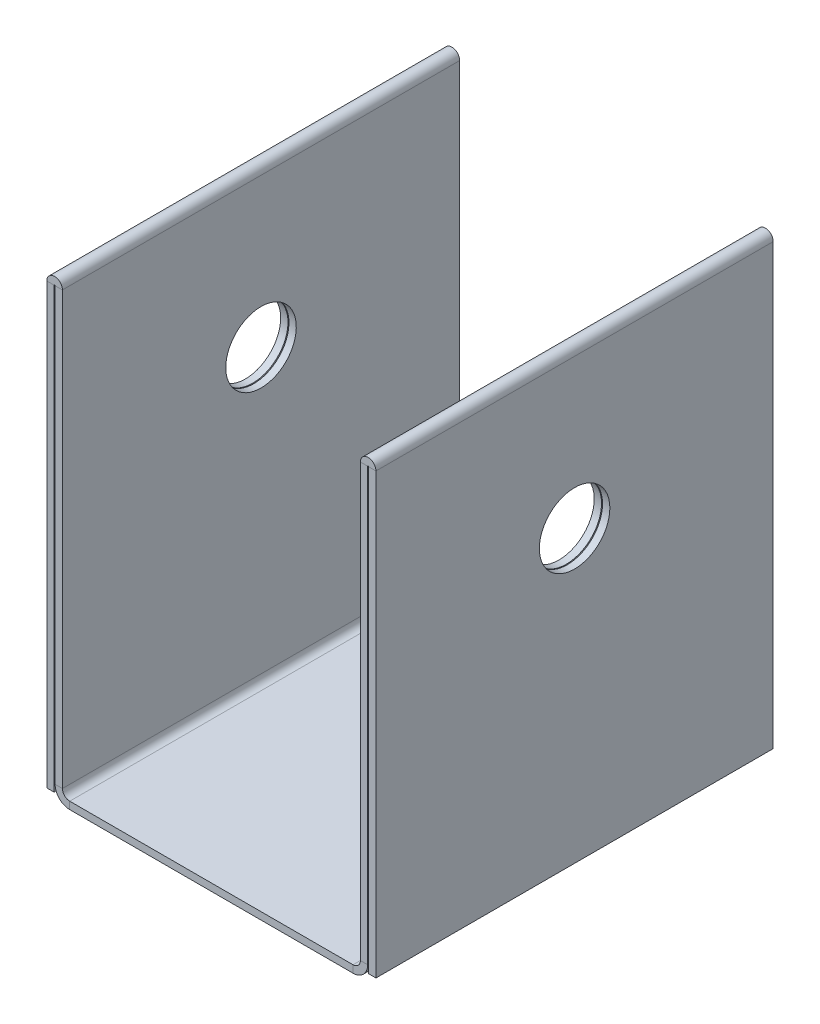
ISO-10303-21;
HEADER;
FILE_DESCRIPTION(('STEP AP214'),'2;1');
FILE_NAME('part.step','',(''),(''),'','','');
FILE_SCHEMA(('AUTOMOTIVE_DESIGN { 1 0 10303 214 1 1 1 1 }'));
ENDSEC;
DATA;
#1=APPLICATION_CONTEXT('core data for automotive mechanical design processes');
#2=APPLICATION_PROTOCOL_DEFINITION('international standard','automotive_design',2000,#1);
#3=PRODUCT_CONTEXT('',#1,'mechanical');
#4=PRODUCT('Part','Part','',(#3));
#5=PRODUCT_RELATED_PRODUCT_CATEGORY('part','',(#4));
#6=PRODUCT_DEFINITION_FORMATION('','',#4);
#7=PRODUCT_DEFINITION_CONTEXT('part definition',#1,'design');
#8=PRODUCT_DEFINITION('design','',#6,#7);
#9=PRODUCT_DEFINITION_SHAPE('','',#8);
#10=(LENGTH_UNIT() NAMED_UNIT(*) SI_UNIT(.MILLI.,.METRE.));
#11=(NAMED_UNIT(*) PLANE_ANGLE_UNIT() SI_UNIT($,.RADIAN.));
#12=(NAMED_UNIT(*) SI_UNIT($,.STERADIAN.) SOLID_ANGLE_UNIT());
#13=UNCERTAINTY_MEASURE_WITH_UNIT(LENGTH_MEASURE(1.E-05),#10,'distance_accuracy_value','');
#14=(GEOMETRIC_REPRESENTATION_CONTEXT(3) GLOBAL_UNCERTAINTY_ASSIGNED_CONTEXT((#13)) GLOBAL_UNIT_ASSIGNED_CONTEXT((#10,
#11,#12)) REPRESENTATION_CONTEXT('',''));
#15=CARTESIAN_POINT('',(0.,0.,0.));
#16=DIRECTION('',(0.,0.,1.));
#17=DIRECTION('',(1.,0.,0.));
#18=AXIS2_PLACEMENT_3D('',#15,#16,#17);
#19=CARTESIAN_POINT('',(0.,-0.7366,0.));
#20=DIRECTION('',(0.,1.,0.));
#21=DIRECTION('',(0.,0.,1.));
#22=AXIS2_PLACEMENT_3D('',#19,#20,#21);
#23=PLANE('',#22);
#24=DIRECTION('',(0.,0.,1.));
#25=VECTOR('',#24,1.);
#26=CARTESIAN_POINT('',(-14.2634,-0.736600000000002,20.));
#27=LINE('',#26,#25);
#28=CARTESIAN_POINT('',(-14.2634,-0.736600000000002,20.));
#29=VERTEX_POINT('',#28);
#30=CARTESIAN_POINT('',(-14.2634,-0.7366,-20.));
#31=VERTEX_POINT('',#30);
#32=EDGE_CURVE('E221',#29,#31,#27,.F.);
#33=ORIENTED_EDGE('',*,*,#32,.T.);
#34=DIRECTION('',(-1.,0.,0.));
#35=VECTOR('',#34,1.);
#36=CARTESIAN_POINT('',(-15.,-0.7366,-20.));
#37=LINE('',#36,#35);
#38=CARTESIAN_POINT('',(14.2634,-0.736599999999999,-20.));
#39=VERTEX_POINT('',#38);
#40=EDGE_CURVE('E44',#39,#31,#37,.T.);
#41=ORIENTED_EDGE('',*,*,#40,.F.);
#42=DIRECTION('',(0.,0.,-1.));
#43=VECTOR('',#42,1.);
#44=CARTESIAN_POINT('',(14.2634,-0.736599999999999,-20.));
#45=LINE('',#44,#43);
#46=CARTESIAN_POINT('',(14.2634,-0.7366,20.));
#47=VERTEX_POINT('',#46);
#48=EDGE_CURVE('E266',#39,#47,#45,.F.);
#49=ORIENTED_EDGE('',*,*,#48,.T.);
#50=DIRECTION('',(1.,0.,0.));
#51=VECTOR('',#50,1.);
#52=CARTESIAN_POINT('',(-15.,-0.7366,20.));
#53=LINE('',#52,#51);
#54=EDGE_CURVE('E11',#29,#47,#53,.T.);
#55=ORIENTED_EDGE('',*,*,#54,.F.);
#56=EDGE_LOOP('',(#33,#41,#49,#55));
#57=FACE_BOUND('',#56,.T.);
#58=ADVANCED_FACE('F35',(#57),#23,.F.);
#59=CARTESIAN_POINT('',(0.,0.,0.));
#60=DIRECTION('',(0.,1.,0.));
#61=DIRECTION('',(0.,0.,1.));
#62=AXIS2_PLACEMENT_3D('',#59,#60,#61);
#63=PLANE('',#62);
#64=DIRECTION('',(-1.,0.,0.));
#65=VECTOR('',#64,1.);
#66=CARTESIAN_POINT('',(-15.,0.,-20.));
#67=LINE('',#66,#65);
#68=CARTESIAN_POINT('',(14.2634,0.,-20.));
#69=VERTEX_POINT('',#68);
#70=CARTESIAN_POINT('',(-14.2634,0.,-20.));
#71=VERTEX_POINT('',#70);
#72=EDGE_CURVE('E287',#69,#71,#67,.T.);
#73=ORIENTED_EDGE('',*,*,#72,.T.);
#74=DIRECTION('',(0.,0.,1.));
#75=VECTOR('',#74,1.);
#76=CARTESIAN_POINT('',(-14.2634,0.,20.));
#77=LINE('',#76,#75);
#78=CARTESIAN_POINT('',(-14.2634,0.,20.));
#79=VERTEX_POINT('',#78);
#80=EDGE_CURVE('E233',#79,#71,#77,.F.);
#81=ORIENTED_EDGE('',*,*,#80,.F.);
#82=DIRECTION('',(1.,0.,0.));
#83=VECTOR('',#82,1.);
#84=CARTESIAN_POINT('',(-15.,0.,20.));
#85=LINE('',#84,#83);
#86=CARTESIAN_POINT('',(14.2634,0.,20.));
#87=VERTEX_POINT('',#86);
#88=EDGE_CURVE('E291',#79,#87,#85,.T.);
#89=ORIENTED_EDGE('',*,*,#88,.T.);
#90=DIRECTION('',(0.,0.,-1.));
#91=VECTOR('',#90,1.);
#92=CARTESIAN_POINT('',(14.2634,0.,-20.));
#93=LINE('',#92,#91);
#94=EDGE_CURVE('E279',#69,#87,#93,.F.);
#95=ORIENTED_EDGE('',*,*,#94,.F.);
#96=EDGE_LOOP('',(#73,#81,#89,#95));
#97=FACE_BOUND('',#96,.T.);
#98=ADVANCED_FACE('F297',(#97),#63,.T.);
#99=CARTESIAN_POINT('',(-15.,-0.7366,20.));
#100=DIRECTION('',(0.,0.,1.));
#101=DIRECTION('',(1.,0.,0.));
#102=AXIS2_PLACEMENT_3D('',#99,#100,#101);
#103=PLANE('',#102);
#104=ORIENTED_EDGE('',*,*,#88,.F.);
#105=DIRECTION('',(0.,-1.,0.));
#106=VECTOR('',#105,1.);
#107=CARTESIAN_POINT('',(-14.2634,0.,20.));
#108=LINE('',#107,#106);
#109=EDGE_CURVE('E227',#79,#29,#108,.T.);
#110=ORIENTED_EDGE('',*,*,#109,.T.);
#111=ORIENTED_EDGE('',*,*,#54,.T.);
#112=DIRECTION('',(0.,-1.,0.));
#113=VECTOR('',#112,1.);
#114=CARTESIAN_POINT('',(14.2634,0.,20.));
#115=LINE('',#114,#113);
#116=EDGE_CURVE('E284',#87,#47,#115,.T.);
#117=ORIENTED_EDGE('',*,*,#116,.F.);
#118=EDGE_LOOP('',(#104,#110,#111,#117));
#119=FACE_BOUND('',#118,.T.);
#120=ADVANCED_FACE('F301',(#119),#103,.T.);
#121=CARTESIAN_POINT('',(-15.,-0.7366,-20.));
#122=DIRECTION('',(0.,0.,-1.));
#123=DIRECTION('',(-1.,0.,0.));
#124=AXIS2_PLACEMENT_3D('',#121,#122,#123);
#125=PLANE('',#124);
#126=DIRECTION('',(0.,-1.,0.));
#127=VECTOR('',#126,1.);
#128=CARTESIAN_POINT('',(-14.2634,0.,-20.));
#129=LINE('',#128,#127);
#130=EDGE_CURVE('E239',#71,#31,#129,.T.);
#131=ORIENTED_EDGE('',*,*,#130,.F.);
#132=ORIENTED_EDGE('',*,*,#72,.F.);
#133=DIRECTION('',(0.,-1.,0.));
#134=VECTOR('',#133,1.);
#135=CARTESIAN_POINT('',(14.2634,0.,-20.));
#136=LINE('',#135,#134);
#137=EDGE_CURVE('E273',#69,#39,#136,.T.);
#138=ORIENTED_EDGE('',*,*,#137,.T.);
#139=ORIENTED_EDGE('',*,*,#40,.T.);
#140=EDGE_LOOP('',(#131,#132,#138,#139));
#141=FACE_BOUND('',#140,.T.);
#142=ADVANCED_FACE('F37',(#141),#125,.T.);
#143=CARTESIAN_POINT('',(14.2634,0.7366,20.));
#144=DIRECTION('',(0.,0.,1.));
#145=DIRECTION('',(0.,-1.,0.));
#146=AXIS2_PLACEMENT_3D('',#143,#144,#145);
#147=PLANE('',#146);
#148=DIRECTION('',(1.,0.,0.));
#149=VECTOR('',#148,1.);
#150=CARTESIAN_POINT('',(15.,0.736599999999997,20.));
#151=LINE('',#150,#149);
#152=CARTESIAN_POINT('',(15.,0.736599999999997,20.));
#153=VERTEX_POINT('',#152);
#154=CARTESIAN_POINT('',(15.7366,0.736599999999995,20.));
#155=VERTEX_POINT('',#154);
#156=EDGE_CURVE('E242',#153,#155,#151,.T.);
#157=ORIENTED_EDGE('',*,*,#156,.F.);
#158=CARTESIAN_POINT('',(14.2634,0.7366,20.));
#159=DIRECTION('',(0.,0.,-1.));
#160=DIRECTION('',(0.,1.,0.));
#161=AXIS2_PLACEMENT_3D('',#158,#159,#160);
#162=CIRCLE('',#161,0.736600000000002);
#163=EDGE_CURVE('E276',#87,#153,#162,.F.);
#164=ORIENTED_EDGE('',*,*,#163,.F.);
#165=ORIENTED_EDGE('',*,*,#116,.T.);
#166=CARTESIAN_POINT('',(14.2634,0.7366,20.));
#167=DIRECTION('',(0.,0.,-1.));
#168=DIRECTION('',(0.,1.,0.));
#169=AXIS2_PLACEMENT_3D('',#166,#167,#168);
#170=CIRCLE('',#169,1.4732);
#171=EDGE_CURVE('E269',#47,#155,#170,.F.);
#172=ORIENTED_EDGE('',*,*,#171,.T.);
#173=EDGE_LOOP('',(#157,#164,#165,#172));
#174=FACE_BOUND('',#173,.T.);
#175=ADVANCED_FACE('F310',(#174),#147,.T.);
#176=CARTESIAN_POINT('',(14.2634,0.736600000000003,-20.));
#177=DIRECTION('',(0.,0.,1.));
#178=DIRECTION('',(0.,-1.,0.));
#179=AXIS2_PLACEMENT_3D('',#176,#177,#178);
#180=PLANE('',#179);
#181=CARTESIAN_POINT('',(14.2634,0.736600000000003,-20.));
#182=DIRECTION('',(0.,0.,-1.));
#183=DIRECTION('',(0.,1.,0.));
#184=AXIS2_PLACEMENT_3D('',#181,#182,#183);
#185=CIRCLE('',#184,0.736600000000002);
#186=CARTESIAN_POINT('',(15.,0.7366,-20.));
#187=VERTEX_POINT('',#186);
#188=EDGE_CURVE('E262',#187,#69,#185,.T.);
#189=ORIENTED_EDGE('',*,*,#188,.F.);
#190=DIRECTION('',(1.,0.,0.));
#191=VECTOR('',#190,1.);
#192=CARTESIAN_POINT('',(15.,0.7366,-20.));
#193=LINE('',#192,#191);
#194=CARTESIAN_POINT('',(15.7366,0.736599999999998,-20.));
#195=VERTEX_POINT('',#194);
#196=EDGE_CURVE('E247',#187,#195,#193,.T.);
#197=ORIENTED_EDGE('',*,*,#196,.T.);
#198=CARTESIAN_POINT('',(14.2634,0.736600000000003,-20.));
#199=DIRECTION('',(0.,0.,-1.));
#200=DIRECTION('',(0.,1.,0.));
#201=AXIS2_PLACEMENT_3D('',#198,#199,#200);
#202=CIRCLE('',#201,1.4732);
#203=EDGE_CURVE('E270',#195,#39,#202,.T.);
#204=ORIENTED_EDGE('',*,*,#203,.T.);
#205=ORIENTED_EDGE('',*,*,#137,.F.);
#206=EDGE_LOOP('',(#189,#197,#204,#205));
#207=FACE_BOUND('',#206,.T.);
#208=ADVANCED_FACE('F325',(#207),#180,.F.);
#209=CARTESIAN_POINT('',(14.2634,0.736600000000003,-20.));
#210=DIRECTION('',(0.,0.,-1.));
#211=DIRECTION('',(1.,0.,0.));
#212=AXIS2_PLACEMENT_3D('',#209,#210,#211);
#213=CYLINDRICAL_SURFACE('',#212,1.4732);
#214=ORIENTED_EDGE('',*,*,#48,.F.);
#215=ORIENTED_EDGE('',*,*,#203,.F.);
#216=DIRECTION('',(0.,0.,1.));
#217=VECTOR('',#216,1.);
#218=CARTESIAN_POINT('',(15.7366,0.736599999999996,0.));
#219=LINE('',#218,#217);
#220=EDGE_CURVE('E250',#195,#155,#219,.T.);
#221=ORIENTED_EDGE('',*,*,#220,.T.);
#222=ORIENTED_EDGE('',*,*,#171,.F.);
#223=EDGE_LOOP('',(#214,#215,#221,#222));
#224=FACE_BOUND('',#223,.T.);
#225=ADVANCED_FACE('F338',(#224),#213,.T.);
#226=CARTESIAN_POINT('',(14.2634,0.736600000000003,-20.));
#227=DIRECTION('',(0.,0.,-1.));
#228=DIRECTION('',(1.,0.,0.));
#229=AXIS2_PLACEMENT_3D('',#226,#227,#228);
#230=CYLINDRICAL_SURFACE('',#229,0.736600000000002);
#231=ORIENTED_EDGE('',*,*,#94,.T.);
#232=ORIENTED_EDGE('',*,*,#163,.T.);
#233=DIRECTION('',(0.,0.,-1.));
#234=VECTOR('',#233,1.);
#235=CARTESIAN_POINT('',(15.,0.736599999999997,20.));
#236=LINE('',#235,#234);
#237=EDGE_CURVE('E245',#153,#187,#236,.T.);
#238=ORIENTED_EDGE('',*,*,#237,.T.);
#239=ORIENTED_EDGE('',*,*,#188,.T.);
#240=EDGE_LOOP('',(#231,#232,#238,#239));
#241=FACE_BOUND('',#240,.T.);
#242=ADVANCED_FACE('F306',(#241),#230,.F.);
#243=CARTESIAN_POINT('',(15.7366,0.,20.));
#244=DIRECTION('',(0.,0.,-1.));
#245=DIRECTION('',(-1.,0.,0.));
#246=AXIS2_PLACEMENT_3D('',#243,#244,#245);
#247=PLANE('',#246);
#248=DIRECTION('',(0.,-1.,0.));
#249=VECTOR('',#248,1.);
#250=CARTESIAN_POINT('',(15.7366,0.,20.));
#251=LINE('',#250,#249);
#252=CARTESIAN_POINT('',(15.7366000000002,44.2134,20.));
#253=VERTEX_POINT('',#252);
#254=EDGE_CURVE('E256',#253,#155,#251,.T.);
#255=ORIENTED_EDGE('',*,*,#254,.F.);
#256=DIRECTION('',(-1.,0.,0.));
#257=VECTOR('',#256,1.);
#258=CARTESIAN_POINT('',(15.7366000000002,44.2134,20.));
#259=LINE('',#258,#257);
#260=CARTESIAN_POINT('',(15.0000000000002,44.2134,20.));
#261=VERTEX_POINT('',#260);
#262=EDGE_CURVE('E316',#253,#261,#259,.T.);
#263=ORIENTED_EDGE('',*,*,#262,.T.);
#264=DIRECTION('',(0.,-1.,0.));
#265=VECTOR('',#264,1.);
#266=CARTESIAN_POINT('',(15.,0.,20.));
#267=LINE('',#266,#265);
#268=EDGE_CURVE('E255',#261,#153,#267,.T.);
#269=ORIENTED_EDGE('',*,*,#268,.T.);
#270=ORIENTED_EDGE('',*,*,#156,.T.);
#271=EDGE_LOOP('',(#255,#263,#269,#270));
#272=FACE_BOUND('',#271,.T.);
#273=ADVANCED_FACE('F313',(#272),#247,.F.);
#274=CARTESIAN_POINT('',(15.7366000000002,45.,-20.));
#275=DIRECTION('',(0.,0.,1.));
#276=DIRECTION('',(0.,-1.,0.));
#277=AXIS2_PLACEMENT_3D('',#274,#275,#276);
#278=PLANE('',#277);
#279=DIRECTION('',(0.,1.,0.));
#280=VECTOR('',#279,1.);
#281=CARTESIAN_POINT('',(15.0000000000002,45.,-20.));
#282=LINE('',#281,#280);
#283=CARTESIAN_POINT('',(15.0000000000001,44.2134,-20.));
#284=VERTEX_POINT('',#283);
#285=EDGE_CURVE('E259',#187,#284,#282,.T.);
#286=ORIENTED_EDGE('',*,*,#285,.T.);
#287=DIRECTION('',(-1.,0.,0.));
#288=VECTOR('',#287,1.);
#289=CARTESIAN_POINT('',(15.7366000000001,44.2134,-20.));
#290=LINE('',#289,#288);
#291=CARTESIAN_POINT('',(15.7366000000001,44.2134,-20.));
#292=VERTEX_POINT('',#291);
#293=EDGE_CURVE('E331',#292,#284,#290,.T.);
#294=ORIENTED_EDGE('',*,*,#293,.F.);
#295=DIRECTION('',(0.,1.,0.));
#296=VECTOR('',#295,1.);
#297=CARTESIAN_POINT('',(15.7366000000002,45.,-20.));
#298=LINE('',#297,#296);
#299=EDGE_CURVE('E258',#195,#292,#298,.T.);
#300=ORIENTED_EDGE('',*,*,#299,.F.);
#301=ORIENTED_EDGE('',*,*,#196,.F.);
#302=EDGE_LOOP('',(#286,#294,#300,#301));
#303=FACE_BOUND('',#302,.T.);
#304=ADVANCED_FACE('F329',(#303),#278,.F.);
#305=CARTESIAN_POINT('',(15.7366,0.,0.));
#306=DIRECTION('',(-1.,0.,0.));
#307=DIRECTION('',(0.,-1.,0.));
#308=AXIS2_PLACEMENT_3D('',#305,#306,#307);
#309=PLANE('',#308);
#310=CARTESIAN_POINT('',(15.7366000000001,29.2133999999999,0.));
#311=DIRECTION('',(-1.,0.,0.));
#312=DIRECTION('',(0.,-1.,0.));
#313=AXIS2_PLACEMENT_3D('',#310,#311,#312);
#314=CIRCLE('',#313,3.54999999999999);
#315=CARTESIAN_POINT('',(15.7366000000001,25.6633999999999,0.));
#316=VERTEX_POINT('',#315);
#317=EDGE_CURVE('E417',#316,#316,#314,.T.);
#318=ORIENTED_EDGE('',*,*,#317,.T.);
#319=EDGE_LOOP('',(#318));
#320=FACE_BOUND('',#319,.T.);
#321=ORIENTED_EDGE('',*,*,#299,.T.);
#322=DIRECTION('',(0.,0.,1.));
#323=VECTOR('',#322,1.);
#324=CARTESIAN_POINT('',(15.7366000000002,44.2134,20.));
#325=LINE('',#324,#323);
#326=EDGE_CURVE('E335',#253,#292,#325,.F.);
#327=ORIENTED_EDGE('',*,*,#326,.F.);
#328=ORIENTED_EDGE('',*,*,#254,.T.);
#329=ORIENTED_EDGE('',*,*,#220,.F.);
#330=EDGE_LOOP('',(#321,#327,#328,#329));
#331=FACE_BOUND('',#330,.T.);
#332=ADVANCED_FACE('F334',(#320,#331),#309,.F.);
#333=CARTESIAN_POINT('',(15.,0.,0.));
#334=DIRECTION('',(-1.,0.,0.));
#335=DIRECTION('',(0.,-1.,0.));
#336=AXIS2_PLACEMENT_3D('',#333,#334,#335);
#337=PLANE('',#336);
#338=CARTESIAN_POINT('',(15.0000000000001,29.2133999999999,0.));
#339=DIRECTION('',(-1.,0.,0.));
#340=DIRECTION('',(0.,-1.,0.));
#341=AXIS2_PLACEMENT_3D('',#338,#339,#340);
#342=CIRCLE('',#341,3.54999999999999);
#343=CARTESIAN_POINT('',(15.0000000000001,25.6633999999999,0.));
#344=VERTEX_POINT('',#343);
#345=EDGE_CURVE('E419',#344,#344,#342,.T.);
#346=ORIENTED_EDGE('',*,*,#345,.F.);
#347=EDGE_LOOP('',(#346));
#348=FACE_BOUND('',#347,.T.);
#349=DIRECTION('',(0.,0.,1.));
#350=VECTOR('',#349,1.);
#351=CARTESIAN_POINT('',(15.0000000000002,44.2134,20.));
#352=LINE('',#351,#350);
#353=EDGE_CURVE('E321',#261,#284,#352,.F.);
#354=ORIENTED_EDGE('',*,*,#353,.T.);
#355=ORIENTED_EDGE('',*,*,#285,.F.);
#356=ORIENTED_EDGE('',*,*,#237,.F.);
#357=ORIENTED_EDGE('',*,*,#268,.F.);
#358=EDGE_LOOP('',(#354,#355,#356,#357));
#359=FACE_BOUND('',#358,.T.);
#360=ADVANCED_FACE('F319',(#348,#359),#337,.T.);
#361=CARTESIAN_POINT('',(-14.2634,0.7366,-20.));
#362=DIRECTION('',(0.,0.,-1.));
#363=DIRECTION('',(-1.,0.,0.));
#364=AXIS2_PLACEMENT_3D('',#361,#362,#363);
#365=PLANE('',#364);
#366=DIRECTION('',(-1.,0.,0.));
#367=VECTOR('',#366,1.);
#368=CARTESIAN_POINT('',(-15.,0.736599999999997,-20.));
#369=LINE('',#368,#367);
#370=CARTESIAN_POINT('',(-15.,0.736599999999998,-20.));
#371=VERTEX_POINT('',#370);
#372=CARTESIAN_POINT('',(-15.7366,0.736599999999995,-20.));
#373=VERTEX_POINT('',#372);
#374=EDGE_CURVE('E351',#371,#373,#369,.T.);
#375=ORIENTED_EDGE('',*,*,#374,.F.);
#376=CARTESIAN_POINT('',(-14.2634,0.7366,-20.));
#377=DIRECTION('',(0.,0.,1.));
#378=DIRECTION('',(1.,0.,0.));
#379=AXIS2_PLACEMENT_3D('',#376,#377,#378);
#380=CIRCLE('',#379,0.736600000000002);
#381=EDGE_CURVE('E230',#71,#371,#380,.F.);
#382=ORIENTED_EDGE('',*,*,#381,.F.);
#383=ORIENTED_EDGE('',*,*,#130,.T.);
#384=CARTESIAN_POINT('',(-14.2634,0.7366,-20.));
#385=DIRECTION('',(0.,0.,1.));
#386=DIRECTION('',(1.,0.,0.));
#387=AXIS2_PLACEMENT_3D('',#384,#385,#386);
#388=CIRCLE('',#387,1.4732);
#389=EDGE_CURVE('E223',#31,#373,#388,.F.);
#390=ORIENTED_EDGE('',*,*,#389,.T.);
#391=EDGE_LOOP('',(#375,#382,#383,#390));
#392=FACE_BOUND('',#391,.T.);
#393=ADVANCED_FACE('F348',(#392),#365,.T.);
#394=CARTESIAN_POINT('',(-14.2634,0.7366,20.));
#395=DIRECTION('',(0.,0.,-1.));
#396=DIRECTION('',(-1.,0.,0.));
#397=AXIS2_PLACEMENT_3D('',#394,#395,#396);
#398=PLANE('',#397);
#399=CARTESIAN_POINT('',(-14.2634,0.7366,20.));
#400=DIRECTION('',(0.,0.,1.));
#401=DIRECTION('',(1.,0.,0.));
#402=AXIS2_PLACEMENT_3D('',#399,#400,#401);
#403=CIRCLE('',#402,0.736600000000002);
#404=CARTESIAN_POINT('',(-15.,0.736599999999998,20.));
#405=VERTEX_POINT('',#404);
#406=EDGE_CURVE('E236',#405,#79,#403,.T.);
#407=ORIENTED_EDGE('',*,*,#406,.F.);
#408=DIRECTION('',(-1.,0.,0.));
#409=VECTOR('',#408,1.);
#410=CARTESIAN_POINT('',(-15.,0.736599999999999,20.));
#411=LINE('',#410,#409);
#412=CARTESIAN_POINT('',(-15.7366,0.736599999999996,20.));
#413=VERTEX_POINT('',#412);
#414=EDGE_CURVE('E212',#405,#413,#411,.T.);
#415=ORIENTED_EDGE('',*,*,#414,.T.);
#416=CARTESIAN_POINT('',(-14.2634,0.7366,20.));
#417=DIRECTION('',(0.,0.,1.));
#418=DIRECTION('',(1.,0.,0.));
#419=AXIS2_PLACEMENT_3D('',#416,#417,#418);
#420=CIRCLE('',#419,1.4732);
#421=EDGE_CURVE('E224',#413,#29,#420,.T.);
#422=ORIENTED_EDGE('',*,*,#421,.T.);
#423=ORIENTED_EDGE('',*,*,#109,.F.);
#424=EDGE_LOOP('',(#407,#415,#422,#423));
#425=FACE_BOUND('',#424,.T.);
#426=ADVANCED_FACE('F372',(#425),#398,.F.);
#427=CARTESIAN_POINT('',(-14.2634,0.7366,20.));
#428=DIRECTION('',(0.,0.,1.));
#429=DIRECTION('',(-1.,0.,0.));
#430=AXIS2_PLACEMENT_3D('',#427,#428,#429);
#431=CYLINDRICAL_SURFACE('',#430,1.4732);
#432=ORIENTED_EDGE('',*,*,#32,.F.);
#433=ORIENTED_EDGE('',*,*,#421,.F.);
#434=DIRECTION('',(0.,0.,-1.));
#435=VECTOR('',#434,1.);
#436=CARTESIAN_POINT('',(-15.7366,0.736599999999995,0.));
#437=LINE('',#436,#435);
#438=EDGE_CURVE('E217',#413,#373,#437,.T.);
#439=ORIENTED_EDGE('',*,*,#438,.T.);
#440=ORIENTED_EDGE('',*,*,#389,.F.);
#441=EDGE_LOOP('',(#432,#433,#439,#440));
#442=FACE_BOUND('',#441,.T.);
#443=ADVANCED_FACE('F370',(#442),#431,.T.);
#444=CARTESIAN_POINT('',(-14.2634,0.7366,20.));
#445=DIRECTION('',(0.,0.,1.));
#446=DIRECTION('',(-1.,0.,0.));
#447=AXIS2_PLACEMENT_3D('',#444,#445,#446);
#448=CYLINDRICAL_SURFACE('',#447,0.736600000000002);
#449=ORIENTED_EDGE('',*,*,#80,.T.);
#450=ORIENTED_EDGE('',*,*,#381,.T.);
#451=DIRECTION('',(0.,0.,1.));
#452=VECTOR('',#451,1.);
#453=CARTESIAN_POINT('',(-15.,0.736599999999997,-20.));
#454=LINE('',#453,#452);
#455=EDGE_CURVE('E354',#371,#405,#454,.T.);
#456=ORIENTED_EDGE('',*,*,#455,.T.);
#457=ORIENTED_EDGE('',*,*,#406,.T.);
#458=EDGE_LOOP('',(#449,#450,#456,#457));
#459=FACE_BOUND('',#458,.T.);
#460=ADVANCED_FACE('F344',(#459),#448,.F.);
#461=CARTESIAN_POINT('',(-15.7366,0.,-20.));
#462=DIRECTION('',(0.,0.,1.));
#463=DIRECTION('',(1.,0.,0.));
#464=AXIS2_PLACEMENT_3D('',#461,#462,#463);
#465=PLANE('',#464);
#466=DIRECTION('',(0.,-1.,0.));
#467=VECTOR('',#466,1.);
#468=CARTESIAN_POINT('',(-15.7366,0.,-20.));
#469=LINE('',#468,#467);
#470=CARTESIAN_POINT('',(-15.7366000000002,44.2134,-20.));
#471=VERTEX_POINT('',#470);
#472=EDGE_CURVE('E213',#471,#373,#469,.T.);
#473=ORIENTED_EDGE('',*,*,#472,.F.);
#474=DIRECTION('',(1.,0.,0.));
#475=VECTOR('',#474,1.);
#476=CARTESIAN_POINT('',(-15.7366000000002,44.2134,-20.));
#477=LINE('',#476,#475);
#478=CARTESIAN_POINT('',(-15.0000000000002,44.2134,-20.));
#479=VERTEX_POINT('',#478);
#480=EDGE_CURVE('E188',#471,#479,#477,.T.);
#481=ORIENTED_EDGE('',*,*,#480,.T.);
#482=DIRECTION('',(0.,-1.,0.));
#483=VECTOR('',#482,1.);
#484=CARTESIAN_POINT('',(-15.,0.,-20.));
#485=LINE('',#484,#483);
#486=EDGE_CURVE('E205',#479,#371,#485,.T.);
#487=ORIENTED_EDGE('',*,*,#486,.T.);
#488=ORIENTED_EDGE('',*,*,#374,.T.);
#489=EDGE_LOOP('',(#473,#481,#487,#488));
#490=FACE_BOUND('',#489,.T.);
#491=ADVANCED_FACE('F559',(#490),#465,.F.);
#492=CARTESIAN_POINT('',(-15.7366000000002,45.,20.));
#493=DIRECTION('',(0.,0.,-1.));
#494=DIRECTION('',(0.,1.,0.));
#495=AXIS2_PLACEMENT_3D('',#492,#493,#494);
#496=PLANE('',#495);
#497=DIRECTION('',(0.,1.,0.));
#498=VECTOR('',#497,1.);
#499=CARTESIAN_POINT('',(-15.0000000000002,45.,20.));
#500=LINE('',#499,#498);
#501=CARTESIAN_POINT('',(-15.0000000000002,44.2134,20.));
#502=VERTEX_POINT('',#501);
#503=EDGE_CURVE('E204',#405,#502,#500,.T.);
#504=ORIENTED_EDGE('',*,*,#503,.T.);
#505=DIRECTION('',(1.,0.,0.));
#506=VECTOR('',#505,1.);
#507=CARTESIAN_POINT('',(-15.7366000000002,44.2134,20.));
#508=LINE('',#507,#506);
#509=CARTESIAN_POINT('',(-15.7366000000002,44.2134,20.));
#510=VERTEX_POINT('',#509);
#511=EDGE_CURVE('E176',#510,#502,#508,.T.);
#512=ORIENTED_EDGE('',*,*,#511,.F.);
#513=DIRECTION('',(0.,1.,0.));
#514=VECTOR('',#513,1.);
#515=CARTESIAN_POINT('',(-15.7366000000002,45.,20.));
#516=LINE('',#515,#514);
#517=EDGE_CURVE('E215',#413,#510,#516,.T.);
#518=ORIENTED_EDGE('',*,*,#517,.F.);
#519=ORIENTED_EDGE('',*,*,#414,.F.);
#520=EDGE_LOOP('',(#504,#512,#518,#519));
#521=FACE_BOUND('',#520,.T.);
#522=ADVANCED_FACE('F210',(#521),#496,.F.);
#523=CARTESIAN_POINT('',(-15.7366,0.,0.));
#524=DIRECTION('',(1.,0.,0.));
#525=DIRECTION('',(0.,1.,0.));
#526=AXIS2_PLACEMENT_3D('',#523,#524,#525);
#527=PLANE('',#526);
#528=CARTESIAN_POINT('',(-15.7366000000001,29.2133999999999,0.));
#529=DIRECTION('',(1.,0.,0.));
#530=DIRECTION('',(0.,1.,0.));
#531=AXIS2_PLACEMENT_3D('',#528,#529,#530);
#532=CIRCLE('',#531,3.54999999999999);
#533=CARTESIAN_POINT('',(-15.7366000000001,32.7633999999999,0.));
#534=VERTEX_POINT('',#533);
#535=EDGE_CURVE('E420',#534,#534,#532,.T.);
#536=ORIENTED_EDGE('',*,*,#535,.T.);
#537=EDGE_LOOP('',(#536));
#538=FACE_BOUND('',#537,.T.);
#539=ORIENTED_EDGE('',*,*,#517,.T.);
#540=DIRECTION('',(0.,0.,-1.));
#541=VECTOR('',#540,1.);
#542=CARTESIAN_POINT('',(-15.7366000000002,44.2134,-20.));
#543=LINE('',#542,#541);
#544=EDGE_CURVE('E368',#471,#510,#543,.F.);
#545=ORIENTED_EDGE('',*,*,#544,.F.);
#546=ORIENTED_EDGE('',*,*,#472,.T.);
#547=ORIENTED_EDGE('',*,*,#438,.F.);
#548=EDGE_LOOP('',(#539,#545,#546,#547));
#549=FACE_BOUND('',#548,.T.);
#550=ADVANCED_FACE('F367',(#538,#549),#527,.F.);
#551=CARTESIAN_POINT('',(-15.,0.,0.));
#552=DIRECTION('',(1.,0.,0.));
#553=DIRECTION('',(0.,1.,0.));
#554=AXIS2_PLACEMENT_3D('',#551,#552,#553);
#555=PLANE('',#554);
#556=CARTESIAN_POINT('',(-15.0000000000001,29.2133999999999,0.));
#557=DIRECTION('',(1.,0.,0.));
#558=DIRECTION('',(0.,1.,0.));
#559=AXIS2_PLACEMENT_3D('',#556,#557,#558);
#560=CIRCLE('',#559,3.54999999999999);
#561=CARTESIAN_POINT('',(-15.0000000000001,32.7633999999999,0.));
#562=VERTEX_POINT('',#561);
#563=EDGE_CURVE('E425',#562,#562,#560,.T.);
#564=ORIENTED_EDGE('',*,*,#563,.F.);
#565=EDGE_LOOP('',(#564));
#566=FACE_BOUND('',#565,.T.);
#567=DIRECTION('',(0.,0.,-1.));
#568=VECTOR('',#567,1.);
#569=CARTESIAN_POINT('',(-15.0000000000002,44.2134,-20.));
#570=LINE('',#569,#568);
#571=EDGE_CURVE('E195',#479,#502,#570,.F.);
#572=ORIENTED_EDGE('',*,*,#571,.T.);
#573=ORIENTED_EDGE('',*,*,#503,.F.);
#574=ORIENTED_EDGE('',*,*,#455,.F.);
#575=ORIENTED_EDGE('',*,*,#486,.F.);
#576=EDGE_LOOP('',(#572,#573,#574,#575));
#577=FACE_BOUND('',#576,.T.);
#578=ADVANCED_FACE('F202',(#566,#577),#555,.T.);
#579=CARTESIAN_POINT('',(16.5732000000001,22.1067,20.));
#580=DIRECTION('',(0.,0.,-1.));
#581=DIRECTION('',(0.,1.,0.));
#582=AXIS2_PLACEMENT_3D('',#579,#580,#581);
#583=PLANE('',#582);
#584=DIRECTION('',(1.,0.,0.));
#585=VECTOR('',#584,1.);
#586=CARTESIAN_POINT('',(16.5732000000001,44.2134,20.));
#587=LINE('',#586,#585);
#588=CARTESIAN_POINT('',(15.8366000000001,44.2134,20.));
#589=VERTEX_POINT('',#588);
#590=CARTESIAN_POINT('',(16.5732000000001,44.2134,20.));
#591=VERTEX_POINT('',#590);
#592=EDGE_CURVE('E359',#589,#591,#587,.T.);
#593=ORIENTED_EDGE('',*,*,#592,.F.);
#594=DIRECTION('',(0.,1.,0.));
#595=VECTOR('',#594,1.);
#596=CARTESIAN_POINT('',(15.8366000000001,22.1067,20.));
#597=LINE('',#596,#595);
#598=CARTESIAN_POINT('',(15.8366,0.,20.));
#599=VERTEX_POINT('',#598);
#600=EDGE_CURVE('E495',#599,#589,#597,.T.);
#601=ORIENTED_EDGE('',*,*,#600,.F.);
#602=DIRECTION('',(1.,0.,0.));
#603=VECTOR('',#602,1.);
#604=CARTESIAN_POINT('',(16.5732,0.,20.));
#605=LINE('',#604,#603);
#606=CARTESIAN_POINT('',(16.5732,0.,20.));
#607=VERTEX_POINT('',#606);
#608=EDGE_CURVE('E502',#599,#607,#605,.T.);
#609=ORIENTED_EDGE('',*,*,#608,.T.);
#610=DIRECTION('',(0.,1.,0.));
#611=VECTOR('',#610,1.);
#612=CARTESIAN_POINT('',(16.5732000000001,22.1067,20.));
#613=LINE('',#612,#611);
#614=EDGE_CURVE('E483',#607,#591,#613,.T.);
#615=ORIENTED_EDGE('',*,*,#614,.T.);
#616=EDGE_LOOP('',(#593,#601,#609,#615));
#617=FACE_BOUND('',#616,.T.);
#618=ADVANCED_FACE('F518',(#617),#583,.F.);
#619=CARTESIAN_POINT('',(16.5732,0.,0.));
#620=DIRECTION('',(0.,1.,0.));
#621=DIRECTION('',(0.,0.,1.));
#622=AXIS2_PLACEMENT_3D('',#619,#620,#621);
#623=PLANE('',#622);
#624=ORIENTED_EDGE('',*,*,#608,.F.);
#625=DIRECTION('',(0.,0.,1.));
#626=VECTOR('',#625,1.);
#627=CARTESIAN_POINT('',(15.8366,0.,0.));
#628=LINE('',#627,#626);
#629=CARTESIAN_POINT('',(15.8366,0.,-20.));
#630=VERTEX_POINT('',#629);
#631=EDGE_CURVE('E492',#630,#599,#628,.T.);
#632=ORIENTED_EDGE('',*,*,#631,.F.);
#633=DIRECTION('',(1.,0.,0.));
#634=VECTOR('',#633,1.);
#635=CARTESIAN_POINT('',(16.5732,0.,-20.));
#636=LINE('',#635,#634);
#637=CARTESIAN_POINT('',(16.5732,0.,-20.));
#638=VERTEX_POINT('',#637);
#639=EDGE_CURVE('E482',#630,#638,#636,.T.);
#640=ORIENTED_EDGE('',*,*,#639,.T.);
#641=DIRECTION('',(0.,0.,1.));
#642=VECTOR('',#641,1.);
#643=CARTESIAN_POINT('',(16.5732,0.,0.));
#644=LINE('',#643,#642);
#645=EDGE_CURVE('E479',#638,#607,#644,.T.);
#646=ORIENTED_EDGE('',*,*,#645,.T.);
#647=EDGE_LOOP('',(#624,#632,#640,#646));
#648=FACE_BOUND('',#647,.T.);
#649=ADVANCED_FACE('F508',(#648),#623,.F.);
#650=CARTESIAN_POINT('',(16.5732000000001,22.1067,-20.));
#651=DIRECTION('',(0.,0.,1.));
#652=DIRECTION('',(0.,-1.,0.));
#653=AXIS2_PLACEMENT_3D('',#650,#651,#652);
#654=PLANE('',#653);
#655=DIRECTION('',(0.,1.,0.));
#656=VECTOR('',#655,1.);
#657=CARTESIAN_POINT('',(15.8366000000001,22.1067,-20.));
#658=LINE('',#657,#656);
#659=CARTESIAN_POINT('',(15.8366000000001,44.2134,-20.));
#660=VERTEX_POINT('',#659);
#661=EDGE_CURVE('E477',#660,#630,#658,.F.);
#662=ORIENTED_EDGE('',*,*,#661,.F.);
#663=DIRECTION('',(1.,0.,0.));
#664=VECTOR('',#663,1.);
#665=CARTESIAN_POINT('',(16.5732000000001,44.2134,-20.));
#666=LINE('',#665,#664);
#667=CARTESIAN_POINT('',(16.5732000000001,44.2134,-20.));
#668=VERTEX_POINT('',#667);
#669=EDGE_CURVE('E355',#660,#668,#666,.T.);
#670=ORIENTED_EDGE('',*,*,#669,.T.);
#671=DIRECTION('',(0.,-1.,0.));
#672=VECTOR('',#671,1.);
#673=CARTESIAN_POINT('',(16.5732000000001,22.1067,-20.));
#674=LINE('',#673,#672);
#675=EDGE_CURVE('E489',#668,#638,#674,.T.);
#676=ORIENTED_EDGE('',*,*,#675,.T.);
#677=ORIENTED_EDGE('',*,*,#639,.F.);
#678=EDGE_LOOP('',(#662,#670,#676,#677));
#679=FACE_BOUND('',#678,.T.);
#680=ADVANCED_FACE('F512',(#679),#654,.F.);
#681=CARTESIAN_POINT('',(16.5732000000001,22.1067,0.));
#682=DIRECTION('',(1.,0.,0.));
#683=DIRECTION('',(0.,1.,0.));
#684=AXIS2_PLACEMENT_3D('',#681,#682,#683);
#685=PLANE('',#684);
#686=CARTESIAN_POINT('',(16.5732000000001,29.2133999999999,0.));
#687=DIRECTION('',(1.,0.,0.));
#688=DIRECTION('',(0.,0.,-1.));
#689=AXIS2_PLACEMENT_3D('',#686,#687,#688);
#690=CIRCLE('',#689,3.54999999999999);
#691=CARTESIAN_POINT('',(16.5732000000001,29.2133999999999,-3.55));
#692=VERTEX_POINT('',#691);
#693=EDGE_CURVE('E944',#692,#692,#690,.T.);
#694=ORIENTED_EDGE('',*,*,#693,.F.);
#695=EDGE_LOOP('',(#694));
#696=FACE_BOUND('',#695,.T.);
#697=ORIENTED_EDGE('',*,*,#645,.F.);
#698=ORIENTED_EDGE('',*,*,#675,.F.);
#699=DIRECTION('',(0.,0.,-1.));
#700=VECTOR('',#699,1.);
#701=CARTESIAN_POINT('',(16.5732000000001,44.2134,0.));
#702=LINE('',#701,#700);
#703=EDGE_CURVE('E486',#591,#668,#702,.T.);
#704=ORIENTED_EDGE('',*,*,#703,.F.);
#705=ORIENTED_EDGE('',*,*,#614,.F.);
#706=EDGE_LOOP('',(#697,#698,#704,#705));
#707=FACE_BOUND('',#706,.T.);
#708=ADVANCED_FACE('F516',(#696,#707),#685,.T.);
#709=CARTESIAN_POINT('',(15.8366000000001,22.1067,0.));
#710=DIRECTION('',(1.,0.,0.));
#711=DIRECTION('',(0.,1.,0.));
#712=AXIS2_PLACEMENT_3D('',#709,#710,#711);
#713=PLANE('',#712);
#714=CARTESIAN_POINT('',(15.8366000000001,29.2133999999999,0.));
#715=DIRECTION('',(1.,0.,0.));
#716=DIRECTION('',(0.,1.,0.));
#717=AXIS2_PLACEMENT_3D('',#714,#715,#716);
#718=CIRCLE('',#717,3.54999999999999);
#719=CARTESIAN_POINT('',(15.8366000000001,32.7633999999999,0.));
#720=VERTEX_POINT('',#719);
#721=EDGE_CURVE('E938',#720,#720,#718,.T.);
#722=ORIENTED_EDGE('',*,*,#721,.T.);
#723=EDGE_LOOP('',(#722));
#724=FACE_BOUND('',#723,.T.);
#725=ORIENTED_EDGE('',*,*,#631,.T.);
#726=ORIENTED_EDGE('',*,*,#600,.T.);
#727=DIRECTION('',(0.,0.,1.));
#728=VECTOR('',#727,1.);
#729=CARTESIAN_POINT('',(15.8366000000001,44.2134,0.));
#730=LINE('',#729,#728);
#731=EDGE_CURVE('E498',#589,#660,#730,.F.);
#732=ORIENTED_EDGE('',*,*,#731,.T.);
#733=ORIENTED_EDGE('',*,*,#661,.T.);
#734=EDGE_LOOP('',(#725,#726,#732,#733));
#735=FACE_BOUND('',#734,.T.);
#736=ADVANCED_FACE('F531',(#724,#735),#713,.F.);
#737=CARTESIAN_POINT('',(15.7866000000001,44.2134,-20.));
#738=DIRECTION('',(0.,0.,-1.));
#739=DIRECTION('',(-1.,0.,0.));
#740=AXIS2_PLACEMENT_3D('',#737,#738,#739);
#741=PLANE('',#740);
#742=ORIENTED_EDGE('',*,*,#669,.F.);
#743=CARTESIAN_POINT('',(15.7866000000001,44.2134,-20.));
#744=DIRECTION('',(0.,0.,1.));
#745=DIRECTION('',(1.,0.,0.));
#746=AXIS2_PLACEMENT_3D('',#743,#744,#745);
#747=CIRCLE('',#746,0.049999999999998);
#748=EDGE_CURVE('E471',#292,#660,#747,.F.);
#749=ORIENTED_EDGE('',*,*,#748,.F.);
#750=ORIENTED_EDGE('',*,*,#293,.T.);
#751=CARTESIAN_POINT('',(15.7866000000001,44.2134,-20.));
#752=DIRECTION('',(0.,0.,1.));
#753=DIRECTION('',(1.,0.,0.));
#754=AXIS2_PLACEMENT_3D('',#751,#752,#753);
#755=CIRCLE('',#754,0.786599999999998);
#756=EDGE_CURVE('E465',#284,#668,#755,.F.);
#757=ORIENTED_EDGE('',*,*,#756,.T.);
#758=EDGE_LOOP('',(#742,#749,#750,#757));
#759=FACE_BOUND('',#758,.T.);
#760=ADVANCED_FACE('F527',(#759),#741,.T.);
#761=CARTESIAN_POINT('',(15.7866000000002,44.2134,20.));
#762=DIRECTION('',(0.,0.,-1.));
#763=DIRECTION('',(-1.,0.,0.));
#764=AXIS2_PLACEMENT_3D('',#761,#762,#763);
#765=PLANE('',#764);
#766=CARTESIAN_POINT('',(15.7866000000002,44.2134,20.));
#767=DIRECTION('',(0.,0.,1.));
#768=DIRECTION('',(1.,0.,0.));
#769=AXIS2_PLACEMENT_3D('',#766,#767,#768);
#770=CIRCLE('',#769,0.049999999999998);
#771=EDGE_CURVE('E60',#589,#253,#770,.T.);
#772=ORIENTED_EDGE('',*,*,#771,.F.);
#773=ORIENTED_EDGE('',*,*,#592,.T.);
#774=CARTESIAN_POINT('',(15.7866000000002,44.2134,20.));
#775=DIRECTION('',(0.,0.,1.));
#776=DIRECTION('',(1.,0.,0.));
#777=AXIS2_PLACEMENT_3D('',#774,#775,#776);
#778=CIRCLE('',#777,0.786599999999998);
#779=EDGE_CURVE('E466',#591,#261,#778,.T.);
#780=ORIENTED_EDGE('',*,*,#779,.T.);
#781=ORIENTED_EDGE('',*,*,#262,.F.);
#782=EDGE_LOOP('',(#772,#773,#780,#781));
#783=FACE_BOUND('',#782,.T.);
#784=ADVANCED_FACE('F522',(#783),#765,.F.);
#785=CARTESIAN_POINT('',(15.7866000000002,44.2134,20.));
#786=DIRECTION('',(0.,0.,1.));
#787=DIRECTION('',(1.,0.,0.));
#788=AXIS2_PLACEMENT_3D('',#785,#786,#787);
#789=CYLINDRICAL_SURFACE('',#788,0.786599999999998);
#790=ORIENTED_EDGE('',*,*,#353,.F.);
#791=ORIENTED_EDGE('',*,*,#779,.F.);
#792=ORIENTED_EDGE('',*,*,#703,.T.);
#793=ORIENTED_EDGE('',*,*,#756,.F.);
#794=EDGE_LOOP('',(#790,#791,#792,#793));
#795=FACE_BOUND('',#794,.T.);
#796=ADVANCED_FACE('F524',(#795),#789,.T.);
#797=CARTESIAN_POINT('',(15.7866000000002,44.2134,20.));
#798=DIRECTION('',(0.,0.,1.));
#799=DIRECTION('',(1.,0.,0.));
#800=AXIS2_PLACEMENT_3D('',#797,#798,#799);
#801=CYLINDRICAL_SURFACE('',#800,0.049999999999998);
#802=ORIENTED_EDGE('',*,*,#326,.T.);
#803=ORIENTED_EDGE('',*,*,#748,.T.);
#804=ORIENTED_EDGE('',*,*,#731,.F.);
#805=ORIENTED_EDGE('',*,*,#771,.T.);
#806=EDGE_LOOP('',(#802,#803,#804,#805));
#807=FACE_BOUND('',#806,.T.);
#808=ADVANCED_FACE('F529',(#807),#801,.F.);
#809=CARTESIAN_POINT('',(-16.5732000000001,22.1067,-20.));
#810=DIRECTION('',(0.,0.,1.));
#811=DIRECTION('',(0.,1.,0.));
#812=AXIS2_PLACEMENT_3D('',#809,#810,#811);
#813=PLANE('',#812);
#814=DIRECTION('',(-1.,0.,0.));
#815=VECTOR('',#814,1.);
#816=CARTESIAN_POINT('',(-16.5732000000002,44.2134,-20.));
#817=LINE('',#816,#815);
#818=CARTESIAN_POINT('',(-15.8366000000002,44.2134,-20.));
#819=VERTEX_POINT('',#818);
#820=CARTESIAN_POINT('',(-16.5732000000002,44.2134,-20.));
#821=VERTEX_POINT('',#820);
#822=EDGE_CURVE('E457',#819,#821,#817,.T.);
#823=ORIENTED_EDGE('',*,*,#822,.F.);
#824=DIRECTION('',(0.,-1.,0.));
#825=VECTOR('',#824,1.);
#826=CARTESIAN_POINT('',(-15.8366000000001,22.1067,-20.));
#827=LINE('',#826,#825);
#828=CARTESIAN_POINT('',(-15.8366,0.,-20.));
#829=VERTEX_POINT('',#828);
#830=EDGE_CURVE('E448',#829,#819,#827,.F.);
#831=ORIENTED_EDGE('',*,*,#830,.F.);
#832=DIRECTION('',(-1.,0.,0.));
#833=VECTOR('',#832,1.);
#834=CARTESIAN_POINT('',(-16.5732,0.,-20.));
#835=LINE('',#834,#833);
#836=CARTESIAN_POINT('',(-16.5732,0.,-20.));
#837=VERTEX_POINT('',#836);
#838=EDGE_CURVE('E455',#829,#837,#835,.T.);
#839=ORIENTED_EDGE('',*,*,#838,.T.);
#840=DIRECTION('',(0.,1.,0.));
#841=VECTOR('',#840,1.);
#842=CARTESIAN_POINT('',(-16.5732000000001,22.1067,-20.));
#843=LINE('',#842,#841);
#844=EDGE_CURVE('E438',#837,#821,#843,.T.);
#845=ORIENTED_EDGE('',*,*,#844,.T.);
#846=EDGE_LOOP('',(#823,#831,#839,#845));
#847=FACE_BOUND('',#846,.T.);
#848=ADVANCED_FACE('F693',(#847),#813,.F.);
#849=CARTESIAN_POINT('',(-16.5732,0.,0.));
#850=DIRECTION('',(0.,1.,0.));
#851=DIRECTION('',(0.,0.,-1.));
#852=AXIS2_PLACEMENT_3D('',#849,#850,#851);
#853=PLANE('',#852);
#854=ORIENTED_EDGE('',*,*,#838,.F.);
#855=DIRECTION('',(0.,0.,1.));
#856=VECTOR('',#855,1.);
#857=CARTESIAN_POINT('',(-15.8366,0.,0.));
#858=LINE('',#857,#856);
#859=CARTESIAN_POINT('',(-15.8366,0.,20.));
#860=VERTEX_POINT('',#859);
#861=EDGE_CURVE('E445',#860,#829,#858,.F.);
#862=ORIENTED_EDGE('',*,*,#861,.F.);
#863=DIRECTION('',(-1.,0.,0.));
#864=VECTOR('',#863,1.);
#865=CARTESIAN_POINT('',(-16.5732,0.,20.));
#866=LINE('',#865,#864);
#867=CARTESIAN_POINT('',(-16.5732,0.,20.));
#868=VERTEX_POINT('',#867);
#869=EDGE_CURVE('E437',#860,#868,#866,.T.);
#870=ORIENTED_EDGE('',*,*,#869,.T.);
#871=DIRECTION('',(0.,0.,-1.));
#872=VECTOR('',#871,1.);
#873=CARTESIAN_POINT('',(-16.5732,0.,0.));
#874=LINE('',#873,#872);
#875=EDGE_CURVE('E434',#868,#837,#874,.T.);
#876=ORIENTED_EDGE('',*,*,#875,.T.);
#877=EDGE_LOOP('',(#854,#862,#870,#876));
#878=FACE_BOUND('',#877,.T.);
#879=ADVANCED_FACE('F690',(#878),#853,.F.);
#880=CARTESIAN_POINT('',(-16.5732000000001,22.1067,20.));
#881=DIRECTION('',(0.,0.,-1.));
#882=DIRECTION('',(0.,-1.,0.));
#883=AXIS2_PLACEMENT_3D('',#880,#881,#882);
#884=PLANE('',#883);
#885=DIRECTION('',(0.,-1.,0.));
#886=VECTOR('',#885,1.);
#887=CARTESIAN_POINT('',(-15.8366000000001,22.1067,20.));
#888=LINE('',#887,#886);
#889=CARTESIAN_POINT('',(-15.8366000000001,44.2134,20.));
#890=VERTEX_POINT('',#889);
#891=EDGE_CURVE('E187',#890,#860,#888,.T.);
#892=ORIENTED_EDGE('',*,*,#891,.F.);
#893=DIRECTION('',(-1.,0.,0.));
#894=VECTOR('',#893,1.);
#895=CARTESIAN_POINT('',(-16.5732000000001,44.2134,20.));
#896=LINE('',#895,#894);
#897=CARTESIAN_POINT('',(-16.5732000000002,44.2134,20.));
#898=VERTEX_POINT('',#897);
#899=EDGE_CURVE('E460',#890,#898,#896,.T.);
#900=ORIENTED_EDGE('',*,*,#899,.T.);
#901=DIRECTION('',(0.,-1.,0.));
#902=VECTOR('',#901,1.);
#903=CARTESIAN_POINT('',(-16.5732000000001,22.1067,20.));
#904=LINE('',#903,#902);
#905=EDGE_CURVE('E442',#898,#868,#904,.T.);
#906=ORIENTED_EDGE('',*,*,#905,.T.);
#907=ORIENTED_EDGE('',*,*,#869,.F.);
#908=EDGE_LOOP('',(#892,#900,#906,#907));
#909=FACE_BOUND('',#908,.T.);
#910=ADVANCED_FACE('F621',(#909),#884,.F.);
#911=CARTESIAN_POINT('',(-16.5732000000001,22.1067,0.));
#912=DIRECTION('',(-1.,0.,0.));
#913=DIRECTION('',(0.,-1.,0.));
#914=AXIS2_PLACEMENT_3D('',#911,#912,#913);
#915=PLANE('',#914);
#916=CARTESIAN_POINT('',(-16.5732000000002,29.2133999999999,0.));
#917=DIRECTION('',(1.,0.,0.));
#918=DIRECTION('',(0.,0.,-1.));
#919=AXIS2_PLACEMENT_3D('',#916,#917,#918);
#920=CIRCLE('',#919,3.54999999999999);
#921=CARTESIAN_POINT('',(-16.5732000000002,29.2133999999999,-3.55));
#922=VERTEX_POINT('',#921);
#923=EDGE_CURVE('E941',#922,#922,#920,.T.);
#924=ORIENTED_EDGE('',*,*,#923,.T.);
#925=EDGE_LOOP('',(#924));
#926=FACE_BOUND('',#925,.T.);
#927=ORIENTED_EDGE('',*,*,#875,.F.);
#928=ORIENTED_EDGE('',*,*,#905,.F.);
#929=DIRECTION('',(0.,0.,1.));
#930=VECTOR('',#929,1.);
#931=CARTESIAN_POINT('',(-16.5732000000002,44.2134,0.));
#932=LINE('',#931,#930);
#933=EDGE_CURVE('E197',#821,#898,#932,.T.);
#934=ORIENTED_EDGE('',*,*,#933,.F.);
#935=ORIENTED_EDGE('',*,*,#844,.F.);
#936=EDGE_LOOP('',(#927,#928,#934,#935));
#937=FACE_BOUND('',#936,.T.);
#938=ADVANCED_FACE('F615',(#926,#937),#915,.T.);
#939=CARTESIAN_POINT('',(-15.8366000000001,22.1067,0.));
#940=DIRECTION('',(-1.,0.,0.));
#941=DIRECTION('',(0.,-1.,0.));
#942=AXIS2_PLACEMENT_3D('',#939,#940,#941);
#943=PLANE('',#942);
#944=CARTESIAN_POINT('',(-15.8366000000001,29.2133999999999,0.));
#945=DIRECTION('',(-1.,0.,0.));
#946=DIRECTION('',(0.,-1.,0.));
#947=AXIS2_PLACEMENT_3D('',#944,#945,#946);
#948=CIRCLE('',#947,3.54999999999999);
#949=CARTESIAN_POINT('',(-15.8366000000001,25.6633999999999,0.));
#950=VERTEX_POINT('',#949);
#951=EDGE_CURVE('E39',#950,#950,#948,.T.);
#952=ORIENTED_EDGE('',*,*,#951,.T.);
#953=EDGE_LOOP('',(#952));
#954=FACE_BOUND('',#953,.T.);
#955=ORIENTED_EDGE('',*,*,#861,.T.);
#956=ORIENTED_EDGE('',*,*,#830,.T.);
#957=DIRECTION('',(0.,0.,1.));
#958=VECTOR('',#957,1.);
#959=CARTESIAN_POINT('',(-15.8366000000002,44.2134,0.));
#960=LINE('',#959,#958);
#961=EDGE_CURVE('E451',#819,#890,#960,.T.);
#962=ORIENTED_EDGE('',*,*,#961,.T.);
#963=ORIENTED_EDGE('',*,*,#891,.T.);
#964=EDGE_LOOP('',(#955,#956,#962,#963));
#965=FACE_BOUND('',#964,.T.);
#966=ADVANCED_FACE('F620',(#954,#965),#943,.F.);
#967=CARTESIAN_POINT('',(-15.7866000000002,44.2134,20.));
#968=DIRECTION('',(0.,0.,1.));
#969=DIRECTION('',(1.,0.,0.));
#970=AXIS2_PLACEMENT_3D('',#967,#968,#969);
#971=PLANE('',#970);
#972=ORIENTED_EDGE('',*,*,#899,.F.);
#973=CARTESIAN_POINT('',(-15.7866000000002,44.2134,20.));
#974=DIRECTION('',(0.,0.,-1.));
#975=DIRECTION('',(-1.,0.,0.));
#976=AXIS2_PLACEMENT_3D('',#973,#974,#975);
#977=CIRCLE('',#976,0.049999999999998);
#978=EDGE_CURVE('E182',#510,#890,#977,.F.);
#979=ORIENTED_EDGE('',*,*,#978,.F.);
#980=ORIENTED_EDGE('',*,*,#511,.T.);
#981=CARTESIAN_POINT('',(-15.7866000000002,44.2134,20.));
#982=DIRECTION('',(0.,0.,-1.));
#983=DIRECTION('',(-1.,0.,0.));
#984=AXIS2_PLACEMENT_3D('',#981,#982,#983);
#985=CIRCLE('',#984,0.786599999999998);
#986=EDGE_CURVE('E180',#502,#898,#985,.F.);
#987=ORIENTED_EDGE('',*,*,#986,.T.);
#988=EDGE_LOOP('',(#972,#979,#980,#987));
#989=FACE_BOUND('',#988,.T.);
#990=ADVANCED_FACE('F179',(#989),#971,.T.);
#991=CARTESIAN_POINT('',(-15.7866000000002,44.2134,-20.));
#992=DIRECTION('',(0.,0.,1.));
#993=DIRECTION('',(1.,0.,0.));
#994=AXIS2_PLACEMENT_3D('',#991,#992,#993);
#995=PLANE('',#994);
#996=CARTESIAN_POINT('',(-15.7866000000002,44.2134,-20.));
#997=DIRECTION('',(0.,0.,-1.));
#998=DIRECTION('',(-1.,0.,0.));
#999=AXIS2_PLACEMENT_3D('',#996,#997,#998);
#1000=CIRCLE('',#999,0.049999999999998);
#1001=EDGE_CURVE('E52',#819,#471,#1000,.T.);
#1002=ORIENTED_EDGE('',*,*,#1001,.F.);
#1003=ORIENTED_EDGE('',*,*,#822,.T.);
#1004=CARTESIAN_POINT('',(-15.7866000000002,44.2134,-20.));
#1005=DIRECTION('',(0.,0.,-1.));
#1006=DIRECTION('',(-1.,0.,0.));
#1007=AXIS2_PLACEMENT_3D('',#1004,#1005,#1006);
#1008=CIRCLE('',#1007,0.786599999999998);
#1009=EDGE_CURVE('E207',#821,#479,#1008,.T.);
#1010=ORIENTED_EDGE('',*,*,#1009,.T.);
#1011=ORIENTED_EDGE('',*,*,#480,.F.);
#1012=EDGE_LOOP('',(#1002,#1003,#1010,#1011));
#1013=FACE_BOUND('',#1012,.T.);
#1014=ADVANCED_FACE('F684',(#1013),#995,.F.);
#1015=CARTESIAN_POINT('',(-15.7866000000002,44.2134,-20.));
#1016=DIRECTION('',(0.,0.,-1.));
#1017=DIRECTION('',(-1.,0.,0.));
#1018=AXIS2_PLACEMENT_3D('',#1015,#1016,#1017);
#1019=CYLINDRICAL_SURFACE('',#1018,0.786599999999998);
#1020=ORIENTED_EDGE('',*,*,#571,.F.);
#1021=ORIENTED_EDGE('',*,*,#1009,.F.);
#1022=ORIENTED_EDGE('',*,*,#933,.T.);
#1023=ORIENTED_EDGE('',*,*,#986,.F.);
#1024=EDGE_LOOP('',(#1020,#1021,#1022,#1023));
#1025=FACE_BOUND('',#1024,.T.);
#1026=ADVANCED_FACE('F193',(#1025),#1019,.T.);
#1027=CARTESIAN_POINT('',(-15.7866000000002,44.2134,-20.));
#1028=DIRECTION('',(0.,0.,-1.));
#1029=DIRECTION('',(-1.,0.,0.));
#1030=AXIS2_PLACEMENT_3D('',#1027,#1028,#1029);
#1031=CYLINDRICAL_SURFACE('',#1030,0.049999999999998);
#1032=ORIENTED_EDGE('',*,*,#544,.T.);
#1033=ORIENTED_EDGE('',*,*,#978,.T.);
#1034=ORIENTED_EDGE('',*,*,#961,.F.);
#1035=ORIENTED_EDGE('',*,*,#1001,.T.);
#1036=EDGE_LOOP('',(#1032,#1033,#1034,#1035));
#1037=FACE_BOUND('',#1036,.T.);
#1038=ADVANCED_FACE('F648',(#1037),#1031,.F.);
#1039=CARTESIAN_POINT('',(16.5732000000001,29.2133999999999,0.));
#1040=DIRECTION('',(1.,0.,0.));
#1041=DIRECTION('',(0.,0.,-1.));
#1042=AXIS2_PLACEMENT_3D('',#1039,#1040,#1041);
#1043=CYLINDRICAL_SURFACE('',#1042,3.54999999999999);
#1044=ORIENTED_EDGE('',*,*,#923,.F.);
#1045=EDGE_LOOP('',(#1044));
#1046=FACE_BOUND('',#1045,.T.);
#1047=ORIENTED_EDGE('',*,*,#951,.F.);
#1048=EDGE_LOOP('',(#1047));
#1049=FACE_BOUND('',#1048,.T.);
#1050=ADVANCED_FACE('F642',(#1046,#1049),#1043,.F.);
#1051=ORIENTED_EDGE('',*,*,#693,.T.);
#1052=EDGE_LOOP('',(#1051));
#1053=FACE_BOUND('',#1052,.T.);
#1054=ORIENTED_EDGE('',*,*,#721,.F.);
#1055=EDGE_LOOP('',(#1054));
#1056=FACE_BOUND('',#1055,.T.);
#1057=ADVANCED_FACE('F647',(#1053,#1056),#1043,.F.);
#1058=ORIENTED_EDGE('',*,*,#563,.T.);
#1059=EDGE_LOOP('',(#1058));
#1060=FACE_BOUND('',#1059,.T.);
#1061=ORIENTED_EDGE('',*,*,#535,.F.);
#1062=EDGE_LOOP('',(#1061));
#1063=FACE_BOUND('',#1062,.T.);
#1064=ADVANCED_FACE('F661',(#1060,#1063),#1043,.F.);
#1065=ORIENTED_EDGE('',*,*,#345,.T.);
#1066=EDGE_LOOP('',(#1065));
#1067=FACE_BOUND('',#1066,.T.);
#1068=ORIENTED_EDGE('',*,*,#317,.F.);
#1069=EDGE_LOOP('',(#1068));
#1070=FACE_BOUND('',#1069,.T.);
#1071=ADVANCED_FACE('F651',(#1067,#1070),#1043,.F.);
#1072=CLOSED_SHELL('',(#58,#98,#120,#142,#175,#208,#225,#242,#273,#304,#332,#360,#393,#426,#443,
#460,#491,#522,#550,#578,#618,#649,#680,#708,#736,#760,#784,#796,#808,#848,#879,#910,#938,#966,
#990,#1014,#1026,#1038,#1050,#1057,#1064,#1071));
#1073=MANIFOLD_SOLID_BREP('B2',#1072);
#1074=ADVANCED_BREP_SHAPE_REPRESENTATION('',(#18,#1073),#14);
#1075=SHAPE_DEFINITION_REPRESENTATION(#9,#1074);
ENDSEC;
END-ISO-10303-21;
